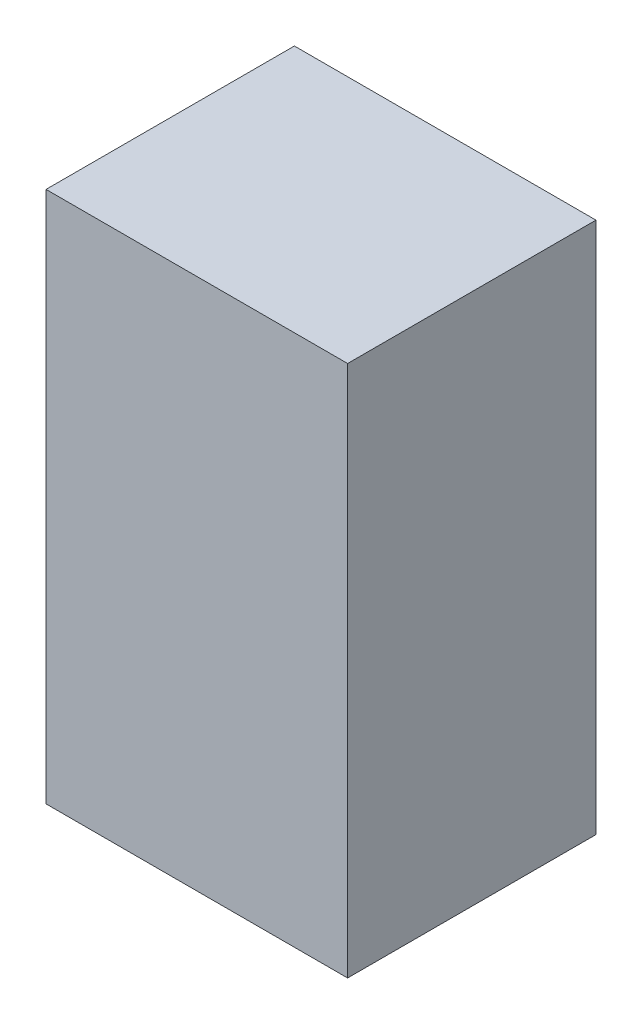
ISO-10303-21;
HEADER;
FILE_DESCRIPTION(('STEP AP214'),'2;1');
FILE_NAME('part.step','',(''),(''),'','','');
FILE_SCHEMA(('AUTOMOTIVE_DESIGN { 1 0 10303 214 1 1 1 1 }'));
ENDSEC;
DATA;
#1=APPLICATION_CONTEXT('core data for automotive mechanical design processes');
#2=APPLICATION_PROTOCOL_DEFINITION('international standard','automotive_design',2000,#1);
#3=PRODUCT_CONTEXT('',#1,'mechanical');
#4=PRODUCT('Part','Part','',(#3));
#5=PRODUCT_RELATED_PRODUCT_CATEGORY('part','',(#4));
#6=PRODUCT_DEFINITION_FORMATION('','',#4);
#7=PRODUCT_DEFINITION_CONTEXT('part definition',#1,'design');
#8=PRODUCT_DEFINITION('design','',#6,#7);
#9=PRODUCT_DEFINITION_SHAPE('','',#8);
#10=(LENGTH_UNIT() NAMED_UNIT(*) SI_UNIT(.MILLI.,.METRE.));
#11=(NAMED_UNIT(*) PLANE_ANGLE_UNIT() SI_UNIT($,.RADIAN.));
#12=(NAMED_UNIT(*) SI_UNIT($,.STERADIAN.) SOLID_ANGLE_UNIT());
#13=UNCERTAINTY_MEASURE_WITH_UNIT(LENGTH_MEASURE(1.E-05),#10,'distance_accuracy_value','');
#14=(GEOMETRIC_REPRESENTATION_CONTEXT(3) GLOBAL_UNCERTAINTY_ASSIGNED_CONTEXT((#13)) GLOBAL_UNIT_ASSIGNED_CONTEXT((#10,
#11,#12)) REPRESENTATION_CONTEXT('',''));
#15=CARTESIAN_POINT('',(0.,0.,0.));
#16=DIRECTION('',(0.,0.,1.));
#17=DIRECTION('',(1.,0.,0.));
#18=AXIS2_PLACEMENT_3D('',#15,#16,#17);
#19=CARTESIAN_POINT('',(-0.8499983,-1.49999954,1.39999974));
#20=DIRECTION('',(0.,0.,1.));
#21=DIRECTION('',(1.,0.,0.));
#22=AXIS2_PLACEMENT_3D('',#19,#20,#21);
#23=PLANE('',#22);
#24=DIRECTION('',(-1.,0.,0.));
#25=VECTOR('',#24,1.);
#26=CARTESIAN_POINT('',(0.85000084,-1.49999954,1.39999974));
#27=LINE('',#26,#25);
#28=CARTESIAN_POINT('',(0.85000084,-1.49999954,1.39999974));
#29=VERTEX_POINT('',#28);
#30=CARTESIAN_POINT('',(-0.8499983,-1.49999954,1.39999974));
#31=VERTEX_POINT('',#30);
#32=EDGE_CURVE('E27',#29,#31,#27,.T.);
#33=ORIENTED_EDGE('',*,*,#32,.F.);
#34=DIRECTION('',(0.,-1.,0.));
#35=VECTOR('',#34,1.);
#36=CARTESIAN_POINT('',(0.85000084,1.49999954,1.39999974));
#37=LINE('',#36,#35);
#38=CARTESIAN_POINT('',(0.85000084,1.49999954,1.39999974));
#39=VERTEX_POINT('',#38);
#40=EDGE_CURVE('E103',#39,#29,#37,.T.);
#41=ORIENTED_EDGE('',*,*,#40,.F.);
#42=DIRECTION('',(1.,0.,0.));
#43=VECTOR('',#42,1.);
#44=CARTESIAN_POINT('',(-0.8499983,1.49999954,1.39999974));
#45=LINE('',#44,#43);
#46=CARTESIAN_POINT('',(-0.8499983,1.49999954,1.39999974));
#47=VERTEX_POINT('',#46);
#48=EDGE_CURVE('E82',#47,#39,#45,.T.);
#49=ORIENTED_EDGE('',*,*,#48,.F.);
#50=DIRECTION('',(0.,1.,0.));
#51=VECTOR('',#50,1.);
#52=CARTESIAN_POINT('',(-0.8499983,-1.49999954,1.39999974));
#53=LINE('',#52,#51);
#54=EDGE_CURVE('E80',#31,#47,#53,.T.);
#55=ORIENTED_EDGE('',*,*,#54,.F.);
#56=EDGE_LOOP('',(#33,#41,#49,#55));
#57=FACE_BOUND('',#56,.T.);
#58=ADVANCED_FACE('F16',(#57),#23,.T.);
#59=CARTESIAN_POINT('',(-0.8499983,-1.49999954,0.));
#60=DIRECTION('',(0.,0.,1.));
#61=DIRECTION('',(1.,0.,0.));
#62=AXIS2_PLACEMENT_3D('',#59,#60,#61);
#63=PLANE('',#62);
#64=DIRECTION('',(0.,1.,0.));
#65=VECTOR('',#64,1.);
#66=CARTESIAN_POINT('',(-0.8499983,-1.49999954,0.));
#67=LINE('',#66,#65);
#68=CARTESIAN_POINT('',(-0.8499983,-1.49999954,0.));
#69=VERTEX_POINT('',#68);
#70=CARTESIAN_POINT('',(-0.8499983,1.49999954,0.));
#71=VERTEX_POINT('',#70);
#72=EDGE_CURVE('E90',#69,#71,#67,.T.);
#73=ORIENTED_EDGE('',*,*,#72,.T.);
#74=DIRECTION('',(1.,0.,0.));
#75=VECTOR('',#74,1.);
#76=CARTESIAN_POINT('',(-0.8499983,1.49999954,0.));
#77=LINE('',#76,#75);
#78=CARTESIAN_POINT('',(0.85000084,1.49999954,0.));
#79=VERTEX_POINT('',#78);
#80=EDGE_CURVE('E98',#71,#79,#77,.T.);
#81=ORIENTED_EDGE('',*,*,#80,.T.);
#82=DIRECTION('',(0.,-1.,0.));
#83=VECTOR('',#82,1.);
#84=CARTESIAN_POINT('',(0.85000084,1.49999954,0.));
#85=LINE('',#84,#83);
#86=CARTESIAN_POINT('',(0.85000084,-1.49999954,0.));
#87=VERTEX_POINT('',#86);
#88=EDGE_CURVE('E77',#79,#87,#85,.T.);
#89=ORIENTED_EDGE('',*,*,#88,.T.);
#90=DIRECTION('',(-1.,0.,0.));
#91=VECTOR('',#90,1.);
#92=CARTESIAN_POINT('',(0.85000084,-1.49999954,0.));
#93=LINE('',#92,#91);
#94=EDGE_CURVE('E11',#87,#69,#93,.T.);
#95=ORIENTED_EDGE('',*,*,#94,.T.);
#96=EDGE_LOOP('',(#73,#81,#89,#95));
#97=FACE_BOUND('',#96,.T.);
#98=ADVANCED_FACE('F119',(#97),#63,.F.);
#99=CARTESIAN_POINT('',(0.85000084,-1.49999954,0.));
#100=DIRECTION('',(0.,-1.,0.));
#101=DIRECTION('',(0.,0.,-1.));
#102=AXIS2_PLACEMENT_3D('',#99,#100,#101);
#103=PLANE('',#102);
#104=DIRECTION('',(0.,0.,1.));
#105=VECTOR('',#104,1.);
#106=CARTESIAN_POINT('',(0.85000084,-1.49999954,0.));
#107=LINE('',#106,#105);
#108=EDGE_CURVE('E20',#87,#29,#107,.T.);
#109=ORIENTED_EDGE('',*,*,#108,.T.);
#110=ORIENTED_EDGE('',*,*,#32,.T.);
#111=DIRECTION('',(0.,0.,1.));
#112=VECTOR('',#111,1.);
#113=CARTESIAN_POINT('',(-0.8499983,-1.49999954,0.));
#114=LINE('',#113,#112);
#115=EDGE_CURVE('E72',#69,#31,#114,.T.);
#116=ORIENTED_EDGE('',*,*,#115,.F.);
#117=ORIENTED_EDGE('',*,*,#94,.F.);
#118=EDGE_LOOP('',(#109,#110,#116,#117));
#119=FACE_BOUND('',#118,.T.);
#120=ADVANCED_FACE('F70',(#119),#103,.T.);
#121=CARTESIAN_POINT('',(0.85000084,1.49999954,0.));
#122=DIRECTION('',(1.,0.,0.));
#123=DIRECTION('',(0.,1.,0.));
#124=AXIS2_PLACEMENT_3D('',#121,#122,#123);
#125=PLANE('',#124);
#126=DIRECTION('',(0.,0.,1.));
#127=VECTOR('',#126,1.);
#128=CARTESIAN_POINT('',(0.85000084,1.49999954,0.));
#129=LINE('',#128,#127);
#130=EDGE_CURVE('E99',#79,#39,#129,.T.);
#131=ORIENTED_EDGE('',*,*,#130,.T.);
#132=ORIENTED_EDGE('',*,*,#40,.T.);
#133=ORIENTED_EDGE('',*,*,#108,.F.);
#134=ORIENTED_EDGE('',*,*,#88,.F.);
#135=EDGE_LOOP('',(#131,#132,#133,#134));
#136=FACE_BOUND('',#135,.T.);
#137=ADVANCED_FACE('F18',(#136),#125,.T.);
#138=CARTESIAN_POINT('',(-0.8499983,1.49999954,0.));
#139=DIRECTION('',(0.,1.,0.));
#140=DIRECTION('',(1.,0.,0.));
#141=AXIS2_PLACEMENT_3D('',#138,#139,#140);
#142=PLANE('',#141);
#143=DIRECTION('',(0.,0.,1.));
#144=VECTOR('',#143,1.);
#145=CARTESIAN_POINT('',(-0.8499983,1.49999954,0.));
#146=LINE('',#145,#144);
#147=EDGE_CURVE('E87',#71,#47,#146,.T.);
#148=ORIENTED_EDGE('',*,*,#147,.T.);
#149=ORIENTED_EDGE('',*,*,#48,.T.);
#150=ORIENTED_EDGE('',*,*,#130,.F.);
#151=ORIENTED_EDGE('',*,*,#80,.F.);
#152=EDGE_LOOP('',(#148,#149,#150,#151));
#153=FACE_BOUND('',#152,.T.);
#154=ADVANCED_FACE('F115',(#153),#142,.T.);
#155=CARTESIAN_POINT('',(-0.8499983,-1.49999954,0.));
#156=DIRECTION('',(-1.,0.,0.));
#157=DIRECTION('',(0.,0.,1.));
#158=AXIS2_PLACEMENT_3D('',#155,#156,#157);
#159=PLANE('',#158);
#160=ORIENTED_EDGE('',*,*,#115,.T.);
#161=ORIENTED_EDGE('',*,*,#54,.T.);
#162=ORIENTED_EDGE('',*,*,#147,.F.);
#163=ORIENTED_EDGE('',*,*,#72,.F.);
#164=EDGE_LOOP('',(#160,#161,#162,#163));
#165=FACE_BOUND('',#164,.T.);
#166=ADVANCED_FACE('F89',(#165),#159,.T.);
#167=CLOSED_SHELL('',(#58,#98,#120,#137,#154,#166));
#168=MANIFOLD_SOLID_BREP('B1',#167);
#169=ADVANCED_BREP_SHAPE_REPRESENTATION('',(#18,#168),#14);
#170=SHAPE_DEFINITION_REPRESENTATION(#9,#169);
ENDSEC;
END-ISO-10303-21;
